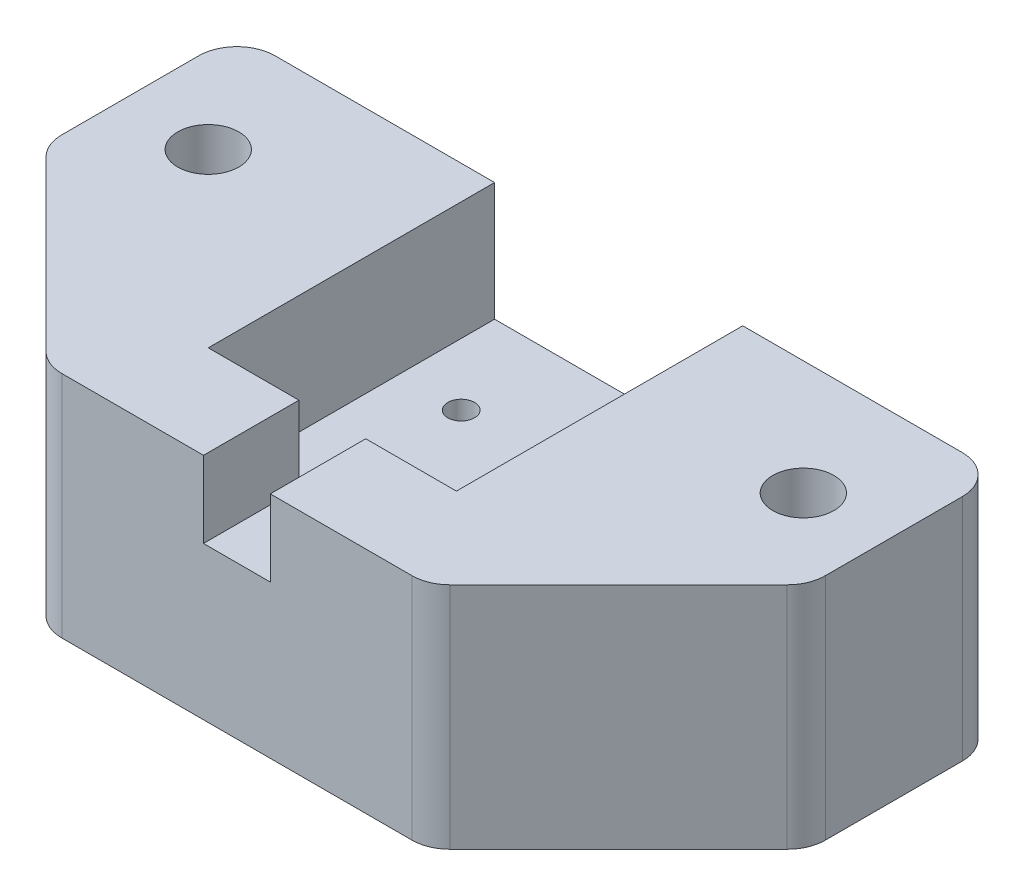
ISO-10303-21;
HEADER;
FILE_DESCRIPTION(('STEP AP214'),'2;1');
FILE_NAME('part.step','',(''),(''),'','','');
FILE_SCHEMA(('AUTOMOTIVE_DESIGN { 1 0 10303 214 1 1 1 1 }'));
ENDSEC;
DATA;
#1=APPLICATION_CONTEXT('core data for automotive mechanical design processes');
#2=APPLICATION_PROTOCOL_DEFINITION('international standard','automotive_design',2000,#1);
#3=PRODUCT_CONTEXT('',#1,'mechanical');
#4=PRODUCT('Part','Part','',(#3));
#5=PRODUCT_RELATED_PRODUCT_CATEGORY('part','',(#4));
#6=PRODUCT_DEFINITION_FORMATION('','',#4);
#7=PRODUCT_DEFINITION_CONTEXT('part definition',#1,'design');
#8=PRODUCT_DEFINITION('design','',#6,#7);
#9=PRODUCT_DEFINITION_SHAPE('','',#8);
#10=(LENGTH_UNIT() NAMED_UNIT(*) SI_UNIT(.MILLI.,.METRE.));
#11=(NAMED_UNIT(*) PLANE_ANGLE_UNIT() SI_UNIT($,.RADIAN.));
#12=(NAMED_UNIT(*) SI_UNIT($,.STERADIAN.) SOLID_ANGLE_UNIT());
#13=UNCERTAINTY_MEASURE_WITH_UNIT(LENGTH_MEASURE(1.E-05),#10,'distance_accuracy_value','');
#14=(GEOMETRIC_REPRESENTATION_CONTEXT(3) GLOBAL_UNCERTAINTY_ASSIGNED_CONTEXT((#13)) GLOBAL_UNIT_ASSIGNED_CONTEXT((#10,
#11,#12)) REPRESENTATION_CONTEXT('',''));
#15=CARTESIAN_POINT('',(0.,0.,0.));
#16=DIRECTION('',(0.,0.,1.));
#17=DIRECTION('',(1.,0.,0.));
#18=AXIS2_PLACEMENT_3D('',#15,#16,#17);
#19=CARTESIAN_POINT('',(4.5,12.,6.));
#20=DIRECTION('',(0.,-1.,0.));
#21=DIRECTION('',(0.,0.,-1.));
#22=AXIS2_PLACEMENT_3D('',#19,#20,#21);
#23=CYLINDRICAL_SURFACE('',#22,1.6);
#24=CARTESIAN_POINT('',(4.5,6.00000000000003,6.));
#25=DIRECTION('',(0.,-1.,0.));
#26=DIRECTION('',(0.,0.,-1.));
#27=AXIS2_PLACEMENT_3D('',#24,#25,#26);
#28=CIRCLE('',#27,1.6);
#29=CARTESIAN_POINT('',(4.5,6.00000000000003,4.4));
#30=VERTEX_POINT('',#29);
#31=EDGE_CURVE('E341',#30,#30,#28,.T.);
#32=ORIENTED_EDGE('',*,*,#31,.T.);
#33=EDGE_LOOP('',(#32));
#34=FACE_BOUND('',#33,.T.);
#35=CARTESIAN_POINT('',(4.5,12.,6.));
#36=DIRECTION('',(0.,1.,0.));
#37=DIRECTION('',(0.,0.,1.));
#38=AXIS2_PLACEMENT_3D('',#35,#36,#37);
#39=CIRCLE('',#38,1.6);
#40=CARTESIAN_POINT('',(4.5,12.,7.6));
#41=VERTEX_POINT('',#40);
#42=EDGE_CURVE('E250',#41,#41,#39,.T.);
#43=ORIENTED_EDGE('',*,*,#42,.T.);
#44=EDGE_LOOP('',(#43));
#45=FACE_BOUND('',#44,.T.);
#46=ADVANCED_FACE('F37',(#34,#45),#23,.F.);
#47=CARTESIAN_POINT('',(35.6728971962617,12.,6.));
#48=DIRECTION('',(0.,-1.,0.));
#49=DIRECTION('',(0.,0.,-1.));
#50=AXIS2_PLACEMENT_3D('',#47,#48,#49);
#51=CYLINDRICAL_SURFACE('',#50,1.6);
#52=CARTESIAN_POINT('',(35.6728971962617,6.00000000000003,6.));
#53=DIRECTION('',(0.,-1.,0.));
#54=DIRECTION('',(0.,0.,-1.));
#55=AXIS2_PLACEMENT_3D('',#52,#53,#54);
#56=CIRCLE('',#55,1.6);
#57=CARTESIAN_POINT('',(35.6728971962617,6.00000000000003,4.4));
#58=VERTEX_POINT('',#57);
#59=EDGE_CURVE('E338',#58,#58,#56,.T.);
#60=ORIENTED_EDGE('',*,*,#59,.T.);
#61=EDGE_LOOP('',(#60));
#62=FACE_BOUND('',#61,.T.);
#63=CARTESIAN_POINT('',(35.6728971962617,12.,6.));
#64=DIRECTION('',(0.,1.,0.));
#65=DIRECTION('',(0.,0.,1.));
#66=AXIS2_PLACEMENT_3D('',#63,#64,#65);
#67=CIRCLE('',#66,1.6);
#68=CARTESIAN_POINT('',(35.6728971962617,12.,7.6));
#69=VERTEX_POINT('',#68);
#70=EDGE_CURVE('E240',#69,#69,#67,.T.);
#71=ORIENTED_EDGE('',*,*,#70,.T.);
#72=EDGE_LOOP('',(#71));
#73=FACE_BOUND('',#72,.T.);
#74=ADVANCED_FACE('F355',(#62,#73),#51,.F.);
#75=CARTESIAN_POINT('',(0.,12.,0.));
#76=DIRECTION('',(0.,1.,0.));
#77=DIRECTION('',(0.,0.,1.));
#78=AXIS2_PLACEMENT_3D('',#75,#76,#77);
#79=PLANE('',#78);
#80=DIRECTION('',(-1.,0.,0.));
#81=VECTOR('',#80,1.);
#82=CARTESIAN_POINT('',(0.,12.,0.));
#83=LINE('',#82,#81);
#84=CARTESIAN_POINT('',(13.5,12.,0.));
#85=VERTEX_POINT('',#84);
#86=CARTESIAN_POINT('',(2.,12.,0.));
#87=VERTEX_POINT('',#86);
#88=EDGE_CURVE('E263',#85,#87,#83,.T.);
#89=ORIENTED_EDGE('',*,*,#88,.T.);
#90=CARTESIAN_POINT('',(2.,12.,2.));
#91=DIRECTION('',(0.,1.,0.));
#92=DIRECTION('',(0.,0.,1.));
#93=AXIS2_PLACEMENT_3D('',#90,#91,#92);
#94=CIRCLE('',#93,2.);
#95=CARTESIAN_POINT('',(0.,12.,2.));
#96=VERTEX_POINT('',#95);
#97=EDGE_CURVE('E313',#87,#96,#94,.T.);
#98=ORIENTED_EDGE('',*,*,#97,.T.);
#99=DIRECTION('',(0.,0.,1.));
#100=VECTOR('',#99,1.);
#101=CARTESIAN_POINT('',(0.,12.,0.));
#102=LINE('',#101,#100);
#103=CARTESIAN_POINT('',(0.,12.,9.17157287525378));
#104=VERTEX_POINT('',#103);
#105=EDGE_CURVE('E254',#96,#104,#102,.T.);
#106=ORIENTED_EDGE('',*,*,#105,.T.);
#107=CARTESIAN_POINT('',(2.,12.,9.17157287525378));
#108=DIRECTION('',(0.,1.,0.));
#109=DIRECTION('',(0.,0.,1.));
#110=AXIS2_PLACEMENT_3D('',#107,#108,#109);
#111=CIRCLE('',#110,2.);
#112=CARTESIAN_POINT('',(0.585786437626904,12.,10.5857864376269));
#113=VERTEX_POINT('',#112);
#114=EDGE_CURVE('E311',#104,#113,#111,.T.);
#115=ORIENTED_EDGE('',*,*,#114,.T.);
#116=DIRECTION('',(-0.707106781186546,0.,-0.707106781186549));
#117=VECTOR('',#116,1.);
#118=CARTESIAN_POINT('',(-4.99999999999999,12.,4.99999999999997));
#119=LINE('',#118,#117);
#120=CARTESIAN_POINT('',(9.4142135623731,12.,19.4142135623731));
#121=VERTEX_POINT('',#120);
#122=EDGE_CURVE('E283',#113,#121,#119,.F.);
#123=ORIENTED_EDGE('',*,*,#122,.T.);
#124=CARTESIAN_POINT('',(10.8284271247462,12.,18.));
#125=DIRECTION('',(0.,1.,0.));
#126=DIRECTION('',(0.,0.,1.));
#127=AXIS2_PLACEMENT_3D('',#124,#125,#126);
#128=CIRCLE('',#127,2.);
#129=CARTESIAN_POINT('',(10.8284271247462,12.,20.));
#130=VERTEX_POINT('',#129);
#131=EDGE_CURVE('E309',#121,#130,#128,.T.);
#132=ORIENTED_EDGE('',*,*,#131,.T.);
#133=DIRECTION('',(1.,0.,0.));
#134=VECTOR('',#133,1.);
#135=CARTESIAN_POINT('',(0.,12.,20.));
#136=LINE('',#135,#134);
#137=CARTESIAN_POINT('',(18.25,12.,20.));
#138=VERTEX_POINT('',#137);
#139=EDGE_CURVE('E259',#130,#138,#136,.T.);
#140=ORIENTED_EDGE('',*,*,#139,.T.);
#141=DIRECTION('',(0.,0.,1.));
#142=VECTOR('',#141,1.);
#143=CARTESIAN_POINT('',(18.25,12.,15.));
#144=LINE('',#143,#142);
#145=CARTESIAN_POINT('',(18.25,12.,15.));
#146=VERTEX_POINT('',#145);
#147=EDGE_CURVE('E183',#146,#138,#144,.T.);
#148=ORIENTED_EDGE('',*,*,#147,.F.);
#149=DIRECTION('',(1.,0.,0.));
#150=VECTOR('',#149,1.);
#151=CARTESIAN_POINT('',(13.5,12.,15.));
#152=LINE('',#151,#150);
#153=CARTESIAN_POINT('',(13.5,12.,15.));
#154=VERTEX_POINT('',#153);
#155=EDGE_CURVE('E233',#154,#146,#152,.T.);
#156=ORIENTED_EDGE('',*,*,#155,.F.);
#157=DIRECTION('',(0.,0.,1.));
#158=VECTOR('',#157,1.);
#159=CARTESIAN_POINT('',(13.5,12.,0.));
#160=LINE('',#159,#158);
#161=EDGE_CURVE('E212',#85,#154,#160,.T.);
#162=ORIENTED_EDGE('',*,*,#161,.F.);
#163=EDGE_LOOP('',(#89,#98,#106,#115,#123,#132,#140,#148,#156,#162));
#164=FACE_BOUND('',#163,.T.);
#165=ORIENTED_EDGE('',*,*,#42,.F.);
#166=EDGE_LOOP('',(#165));
#167=FACE_BOUND('',#166,.T.);
#168=ADVANCED_FACE('F358',(#164,#167),#79,.T.);
#169=CARTESIAN_POINT('',(21.75,12.,20.));
#170=VERTEX_POINT('',#169);
#171=CARTESIAN_POINT('',(29.1715728752538,12.,20.));
#172=VERTEX_POINT('',#171);
#173=EDGE_CURVE('E257',#170,#172,#136,.T.);
#174=ORIENTED_EDGE('',*,*,#173,.T.);
#175=CARTESIAN_POINT('',(29.1715728752538,12.,18.));
#176=DIRECTION('',(0.,1.,0.));
#177=DIRECTION('',(0.,0.,1.));
#178=AXIS2_PLACEMENT_3D('',#175,#176,#177);
#179=CIRCLE('',#178,2.);
#180=CARTESIAN_POINT('',(30.5857864376269,12.,19.4142135623731));
#181=VERTEX_POINT('',#180);
#182=EDGE_CURVE('E328',#172,#181,#179,.T.);
#183=ORIENTED_EDGE('',*,*,#182,.T.);
#184=DIRECTION('',(-0.707106781186549,0.,0.707106781186546));
#185=VECTOR('',#184,1.);
#186=CARTESIAN_POINT('',(24.9999999999999,12.,25.));
#187=LINE('',#186,#185);
#188=CARTESIAN_POINT('',(39.4142135623731,12.,10.5857864376269));
#189=VERTEX_POINT('',#188);
#190=EDGE_CURVE('E281',#181,#189,#187,.F.);
#191=ORIENTED_EDGE('',*,*,#190,.T.);
#192=CARTESIAN_POINT('',(38.,12.,9.17157287525381));
#193=DIRECTION('',(0.,1.,0.));
#194=DIRECTION('',(0.,0.,1.));
#195=AXIS2_PLACEMENT_3D('',#192,#193,#194);
#196=CIRCLE('',#195,2.);
#197=CARTESIAN_POINT('',(40.,12.,9.17157287525381));
#198=VERTEX_POINT('',#197);
#199=EDGE_CURVE('E60',#189,#198,#196,.T.);
#200=ORIENTED_EDGE('',*,*,#199,.T.);
#201=DIRECTION('',(0.,0.,-1.));
#202=VECTOR('',#201,1.);
#203=CARTESIAN_POINT('',(40.,12.,0.));
#204=LINE('',#203,#202);
#205=CARTESIAN_POINT('',(40.,12.,2.));
#206=VERTEX_POINT('',#205);
#207=EDGE_CURVE('E261',#198,#206,#204,.T.);
#208=ORIENTED_EDGE('',*,*,#207,.T.);
#209=CARTESIAN_POINT('',(38.,12.,2.));
#210=DIRECTION('',(0.,1.,0.));
#211=DIRECTION('',(0.,0.,1.));
#212=AXIS2_PLACEMENT_3D('',#209,#210,#211);
#213=CIRCLE('',#212,2.);
#214=CARTESIAN_POINT('',(38.,12.,0.));
#215=VERTEX_POINT('',#214);
#216=EDGE_CURVE('E325',#206,#215,#213,.T.);
#217=ORIENTED_EDGE('',*,*,#216,.T.);
#218=CARTESIAN_POINT('',(26.5,12.,0.));
#219=VERTEX_POINT('',#218);
#220=EDGE_CURVE('E264',#215,#219,#83,.T.);
#221=ORIENTED_EDGE('',*,*,#220,.T.);
#222=DIRECTION('',(0.,0.,-1.));
#223=VECTOR('',#222,1.);
#224=CARTESIAN_POINT('',(26.5,12.,0.));
#225=LINE('',#224,#223);
#226=CARTESIAN_POINT('',(26.5,12.,15.));
#227=VERTEX_POINT('',#226);
#228=EDGE_CURVE('E221',#227,#219,#225,.T.);
#229=ORIENTED_EDGE('',*,*,#228,.F.);
#230=CARTESIAN_POINT('',(21.75,12.,15.));
#231=VERTEX_POINT('',#230);
#232=EDGE_CURVE('E232',#231,#227,#152,.T.);
#233=ORIENTED_EDGE('',*,*,#232,.F.);
#234=DIRECTION('',(0.,0.,-1.));
#235=VECTOR('',#234,1.);
#236=CARTESIAN_POINT('',(21.75,12.,15.));
#237=LINE('',#236,#235);
#238=EDGE_CURVE('E197',#170,#231,#237,.T.);
#239=ORIENTED_EDGE('',*,*,#238,.F.);
#240=EDGE_LOOP('',(#174,#183,#191,#200,#208,#217,#221,#229,#233,#239));
#241=FACE_BOUND('',#240,.T.);
#242=ORIENTED_EDGE('',*,*,#70,.F.);
#243=EDGE_LOOP('',(#242));
#244=FACE_BOUND('',#243,.T.);
#245=ADVANCED_FACE('F362',(#241,#244),#79,.T.);
#246=CARTESIAN_POINT('',(0.,0.,0.));
#247=DIRECTION('',(0.,1.,0.));
#248=DIRECTION('',(0.,0.,1.));
#249=AXIS2_PLACEMENT_3D('',#246,#247,#248);
#250=PLANE('',#249);
#251=CARTESIAN_POINT('',(35.6728971962617,0.,6.));
#252=DIRECTION('',(0.,-1.,0.));
#253=DIRECTION('',(0.,0.,-1.));
#254=AXIS2_PLACEMENT_3D('',#251,#252,#253);
#255=CIRCLE('',#254,3.);
#256=CARTESIAN_POINT('',(35.6728971962617,0.,3.));
#257=VERTEX_POINT('',#256);
#258=EDGE_CURVE('E702',#257,#257,#255,.T.);
#259=ORIENTED_EDGE('',*,*,#258,.F.);
#260=EDGE_LOOP('',(#259));
#261=FACE_BOUND('',#260,.T.);
#262=CARTESIAN_POINT('',(4.5,0.,6.));
#263=DIRECTION('',(0.,-1.,0.));
#264=DIRECTION('',(0.,0.,-1.));
#265=AXIS2_PLACEMENT_3D('',#262,#263,#264);
#266=CIRCLE('',#265,3.);
#267=CARTESIAN_POINT('',(4.5,0.,3.));
#268=VERTEX_POINT('',#267);
#269=EDGE_CURVE('E700',#268,#268,#266,.T.);
#270=ORIENTED_EDGE('',*,*,#269,.F.);
#271=EDGE_LOOP('',(#270));
#272=FACE_BOUND('',#271,.T.);
#273=CARTESIAN_POINT('',(16.75,0.,5.));
#274=DIRECTION('',(0.,1.,0.));
#275=DIRECTION('',(0.,0.,1.));
#276=AXIS2_PLACEMENT_3D('',#273,#274,#275);
#277=CIRCLE('',#276,0.699999999999998);
#278=CARTESIAN_POINT('',(16.75,0.,5.7));
#279=VERTEX_POINT('',#278);
#280=EDGE_CURVE('E208',#279,#279,#277,.T.);
#281=ORIENTED_EDGE('',*,*,#280,.T.);
#282=EDGE_LOOP('',(#281));
#283=FACE_BOUND('',#282,.T.);
#284=CARTESIAN_POINT('',(23.25,0.,5.));
#285=DIRECTION('',(0.,1.,0.));
#286=DIRECTION('',(0.,0.,1.));
#287=AXIS2_PLACEMENT_3D('',#284,#285,#286);
#288=CIRCLE('',#287,0.699999999999998);
#289=CARTESIAN_POINT('',(23.25,0.,5.7));
#290=VERTEX_POINT('',#289);
#291=EDGE_CURVE('E713',#290,#290,#288,.T.);
#292=ORIENTED_EDGE('',*,*,#291,.T.);
#293=EDGE_LOOP('',(#292));
#294=FACE_BOUND('',#293,.T.);
#295=DIRECTION('',(0.,0.,1.));
#296=VECTOR('',#295,1.);
#297=CARTESIAN_POINT('',(0.,0.,0.));
#298=LINE('',#297,#296);
#299=CARTESIAN_POINT('',(0.,0.,2.));
#300=VERTEX_POINT('',#299);
#301=CARTESIAN_POINT('',(0.,0.,9.17157287525378));
#302=VERTEX_POINT('',#301);
#303=EDGE_CURVE('E253',#300,#302,#298,.T.);
#304=ORIENTED_EDGE('',*,*,#303,.F.);
#305=CARTESIAN_POINT('',(2.,0.,2.));
#306=DIRECTION('',(0.,1.,0.));
#307=DIRECTION('',(0.,0.,1.));
#308=AXIS2_PLACEMENT_3D('',#305,#306,#307);
#309=CIRCLE('',#308,2.);
#310=CARTESIAN_POINT('',(2.,0.,0.));
#311=VERTEX_POINT('',#310);
#312=EDGE_CURVE('E302',#300,#311,#309,.F.);
#313=ORIENTED_EDGE('',*,*,#312,.T.);
#314=DIRECTION('',(-1.,0.,0.));
#315=VECTOR('',#314,1.);
#316=CARTESIAN_POINT('',(0.,0.,0.));
#317=LINE('',#316,#315);
#318=CARTESIAN_POINT('',(38.,0.,0.));
#319=VERTEX_POINT('',#318);
#320=EDGE_CURVE('E258',#319,#311,#317,.T.);
#321=ORIENTED_EDGE('',*,*,#320,.F.);
#322=CARTESIAN_POINT('',(38.,0.,2.));
#323=DIRECTION('',(0.,1.,0.));
#324=DIRECTION('',(0.,0.,1.));
#325=AXIS2_PLACEMENT_3D('',#322,#323,#324);
#326=CIRCLE('',#325,2.);
#327=CARTESIAN_POINT('',(40.,0.,2.));
#328=VERTEX_POINT('',#327);
#329=EDGE_CURVE('E292',#319,#328,#326,.F.);
#330=ORIENTED_EDGE('',*,*,#329,.T.);
#331=DIRECTION('',(0.,0.,-1.));
#332=VECTOR('',#331,1.);
#333=CARTESIAN_POINT('',(40.,0.,0.));
#334=LINE('',#333,#332);
#335=CARTESIAN_POINT('',(40.,0.,9.17157287525381));
#336=VERTEX_POINT('',#335);
#337=EDGE_CURVE('E272',#336,#328,#334,.T.);
#338=ORIENTED_EDGE('',*,*,#337,.F.);
#339=CARTESIAN_POINT('',(38.,0.,9.17157287525381));
#340=DIRECTION('',(0.,1.,0.));
#341=DIRECTION('',(0.,0.,1.));
#342=AXIS2_PLACEMENT_3D('',#339,#340,#341);
#343=CIRCLE('',#342,2.);
#344=CARTESIAN_POINT('',(39.4142135623731,0.,10.5857864376269));
#345=VERTEX_POINT('',#344);
#346=EDGE_CURVE('E294',#336,#345,#343,.F.);
#347=ORIENTED_EDGE('',*,*,#346,.T.);
#348=DIRECTION('',(0.707106781186549,0.,-0.707106781186546));
#349=VECTOR('',#348,1.);
#350=CARTESIAN_POINT('',(40.,0.,10.));
#351=LINE('',#350,#349);
#352=CARTESIAN_POINT('',(30.5857864376269,0.,19.4142135623731));
#353=VERTEX_POINT('',#352);
#354=EDGE_CURVE('E278',#345,#353,#351,.F.);
#355=ORIENTED_EDGE('',*,*,#354,.T.);
#356=CARTESIAN_POINT('',(29.1715728752538,0.,18.));
#357=DIRECTION('',(0.,1.,0.));
#358=DIRECTION('',(0.,0.,1.));
#359=AXIS2_PLACEMENT_3D('',#356,#357,#358);
#360=CIRCLE('',#359,2.);
#361=CARTESIAN_POINT('',(29.1715728752538,0.,20.));
#362=VERTEX_POINT('',#361);
#363=EDGE_CURVE('E296',#353,#362,#360,.F.);
#364=ORIENTED_EDGE('',*,*,#363,.T.);
#365=DIRECTION('',(1.,0.,0.));
#366=VECTOR('',#365,1.);
#367=CARTESIAN_POINT('',(0.,0.,20.));
#368=LINE('',#367,#366);
#369=CARTESIAN_POINT('',(10.8284271247462,0.,20.));
#370=VERTEX_POINT('',#369);
#371=EDGE_CURVE('E269',#370,#362,#368,.T.);
#372=ORIENTED_EDGE('',*,*,#371,.F.);
#373=CARTESIAN_POINT('',(10.8284271247462,0.,18.));
#374=DIRECTION('',(0.,1.,0.));
#375=DIRECTION('',(0.,0.,1.));
#376=AXIS2_PLACEMENT_3D('',#373,#374,#375);
#377=CIRCLE('',#376,2.);
#378=CARTESIAN_POINT('',(9.41421356237309,0.,19.4142135623731));
#379=VERTEX_POINT('',#378);
#380=EDGE_CURVE('E298',#370,#379,#377,.F.);
#381=ORIENTED_EDGE('',*,*,#380,.T.);
#382=DIRECTION('',(0.707106781186546,0.,0.707106781186549));
#383=VECTOR('',#382,1.);
#384=CARTESIAN_POINT('',(10.,0.,20.));
#385=LINE('',#384,#383);
#386=CARTESIAN_POINT('',(0.585786437626903,0.,10.5857864376269));
#387=VERTEX_POINT('',#386);
#388=EDGE_CURVE('E266',#379,#387,#385,.F.);
#389=ORIENTED_EDGE('',*,*,#388,.T.);
#390=CARTESIAN_POINT('',(2.,0.,9.17157287525378));
#391=DIRECTION('',(0.,1.,0.));
#392=DIRECTION('',(0.,0.,1.));
#393=AXIS2_PLACEMENT_3D('',#390,#391,#392);
#394=CIRCLE('',#393,2.);
#395=EDGE_CURVE('E300',#387,#302,#394,.F.);
#396=ORIENTED_EDGE('',*,*,#395,.T.);
#397=EDGE_LOOP('',(#304,#313,#321,#330,#338,#347,#355,#364,#372,#381,#389,#396));
#398=FACE_BOUND('',#397,.T.);
#399=ADVANCED_FACE('F364',(#261,#272,#283,#294,#398),#250,.F.);
#400=CARTESIAN_POINT('',(0.,12.,0.));
#401=DIRECTION('',(1.,0.,0.));
#402=DIRECTION('',(0.,0.,-1.));
#403=AXIS2_PLACEMENT_3D('',#400,#401,#402);
#404=PLANE('',#403);
#405=ORIENTED_EDGE('',*,*,#105,.F.);
#406=DIRECTION('',(0.,-1.,0.));
#407=VECTOR('',#406,1.);
#408=CARTESIAN_POINT('',(0.,12.,2.));
#409=LINE('',#408,#407);
#410=EDGE_CURVE('E289',#96,#300,#409,.T.);
#411=ORIENTED_EDGE('',*,*,#410,.T.);
#412=ORIENTED_EDGE('',*,*,#303,.T.);
#413=DIRECTION('',(0.,-1.,0.));
#414=VECTOR('',#413,1.);
#415=CARTESIAN_POINT('',(0.,12.,9.17157287525378));
#416=LINE('',#415,#414);
#417=EDGE_CURVE('E286',#302,#104,#416,.F.);
#418=ORIENTED_EDGE('',*,*,#417,.T.);
#419=EDGE_LOOP('',(#405,#411,#412,#418));
#420=FACE_BOUND('',#419,.T.);
#421=ADVANCED_FACE('F370',(#420),#404,.F.);
#422=CARTESIAN_POINT('',(0.,12.,20.));
#423=DIRECTION('',(0.,0.,-1.));
#424=DIRECTION('',(-1.,0.,0.));
#425=AXIS2_PLACEMENT_3D('',#422,#423,#424);
#426=PLANE('',#425);
#427=ORIENTED_EDGE('',*,*,#139,.F.);
#428=DIRECTION('',(0.,1.,0.));
#429=VECTOR('',#428,1.);
#430=CARTESIAN_POINT('',(10.8284271247462,0.,20.));
#431=LINE('',#430,#429);
#432=EDGE_CURVE('E322',#130,#370,#431,.F.);
#433=ORIENTED_EDGE('',*,*,#432,.T.);
#434=ORIENTED_EDGE('',*,*,#371,.T.);
#435=DIRECTION('',(0.,-1.,0.));
#436=VECTOR('',#435,1.);
#437=CARTESIAN_POINT('',(29.1715728752538,12.,20.));
#438=LINE('',#437,#436);
#439=EDGE_CURVE('E319',#362,#172,#438,.F.);
#440=ORIENTED_EDGE('',*,*,#439,.T.);
#441=ORIENTED_EDGE('',*,*,#173,.F.);
#442=DIRECTION('',(0.,1.,0.));
#443=VECTOR('',#442,1.);
#444=CARTESIAN_POINT('',(21.75,8.,20.));
#445=LINE('',#444,#443);
#446=CARTESIAN_POINT('',(21.75,8.,20.));
#447=VERTEX_POINT('',#446);
#448=EDGE_CURVE('E187',#447,#170,#445,.T.);
#449=ORIENTED_EDGE('',*,*,#448,.F.);
#450=DIRECTION('',(1.,0.,0.));
#451=VECTOR('',#450,1.);
#452=CARTESIAN_POINT('',(18.25,8.,20.));
#453=LINE('',#452,#451);
#454=CARTESIAN_POINT('',(18.25,8.,20.));
#455=VERTEX_POINT('',#454);
#456=EDGE_CURVE('E193',#455,#447,#453,.T.);
#457=ORIENTED_EDGE('',*,*,#456,.F.);
#458=DIRECTION('',(0.,1.,0.));
#459=VECTOR('',#458,1.);
#460=CARTESIAN_POINT('',(18.25,8.,20.));
#461=LINE('',#460,#459);
#462=EDGE_CURVE('E177',#455,#138,#461,.T.);
#463=ORIENTED_EDGE('',*,*,#462,.T.);
#464=EDGE_LOOP('',(#427,#433,#434,#440,#441,#449,#457,#463));
#465=FACE_BOUND('',#464,.T.);
#466=ADVANCED_FACE('F199',(#465),#426,.F.);
#467=CARTESIAN_POINT('',(40.,12.,0.));
#468=DIRECTION('',(-1.,0.,0.));
#469=DIRECTION('',(0.,0.,1.));
#470=AXIS2_PLACEMENT_3D('',#467,#468,#469);
#471=PLANE('',#470);
#472=ORIENTED_EDGE('',*,*,#207,.F.);
#473=DIRECTION('',(0.,1.,0.));
#474=VECTOR('',#473,1.);
#475=CARTESIAN_POINT('',(40.,0.,9.17157287525381));
#476=LINE('',#475,#474);
#477=EDGE_CURVE('E335',#198,#336,#476,.F.);
#478=ORIENTED_EDGE('',*,*,#477,.T.);
#479=ORIENTED_EDGE('',*,*,#337,.T.);
#480=DIRECTION('',(0.,-1.,0.));
#481=VECTOR('',#480,1.);
#482=CARTESIAN_POINT('',(40.,12.,2.));
#483=LINE('',#482,#481);
#484=EDGE_CURVE('E53',#328,#206,#483,.F.);
#485=ORIENTED_EDGE('',*,*,#484,.T.);
#486=EDGE_LOOP('',(#472,#478,#479,#485));
#487=FACE_BOUND('',#486,.T.);
#488=ADVANCED_FACE('F584',(#487),#471,.F.);
#489=CARTESIAN_POINT('',(0.,12.,0.));
#490=DIRECTION('',(0.,0.,1.));
#491=DIRECTION('',(1.,0.,0.));
#492=AXIS2_PLACEMENT_3D('',#489,#490,#491);
#493=PLANE('',#492);
#494=ORIENTED_EDGE('',*,*,#320,.T.);
#495=DIRECTION('',(0.,-1.,0.));
#496=VECTOR('',#495,1.);
#497=CARTESIAN_POINT('',(2.,12.,0.));
#498=LINE('',#497,#496);
#499=EDGE_CURVE('E307',#311,#87,#498,.F.);
#500=ORIENTED_EDGE('',*,*,#499,.T.);
#501=ORIENTED_EDGE('',*,*,#88,.F.);
#502=DIRECTION('',(0.,1.,0.));
#503=VECTOR('',#502,1.);
#504=CARTESIAN_POINT('',(13.5,5.8,0.));
#505=LINE('',#504,#503);
#506=CARTESIAN_POINT('',(13.5,5.8,0.));
#507=VERTEX_POINT('',#506);
#508=EDGE_CURVE('E238',#507,#85,#505,.T.);
#509=ORIENTED_EDGE('',*,*,#508,.F.);
#510=DIRECTION('',(-1.,0.,0.));
#511=VECTOR('',#510,1.);
#512=CARTESIAN_POINT('',(13.5,5.8,0.));
#513=LINE('',#512,#511);
#514=CARTESIAN_POINT('',(26.5,5.8,0.));
#515=VERTEX_POINT('',#514);
#516=EDGE_CURVE('E226',#515,#507,#513,.T.);
#517=ORIENTED_EDGE('',*,*,#516,.F.);
#518=DIRECTION('',(0.,1.,0.));
#519=VECTOR('',#518,1.);
#520=CARTESIAN_POINT('',(26.5,5.8,0.));
#521=LINE('',#520,#519);
#522=EDGE_CURVE('E241',#515,#219,#521,.T.);
#523=ORIENTED_EDGE('',*,*,#522,.T.);
#524=ORIENTED_EDGE('',*,*,#220,.F.);
#525=DIRECTION('',(0.,-1.,0.));
#526=VECTOR('',#525,1.);
#527=CARTESIAN_POINT('',(38.,12.,0.));
#528=LINE('',#527,#526);
#529=EDGE_CURVE('E304',#215,#319,#528,.T.);
#530=ORIENTED_EDGE('',*,*,#529,.T.);
#531=EDGE_LOOP('',(#494,#500,#501,#509,#517,#523,#524,#530));
#532=FACE_BOUND('',#531,.T.);
#533=ADVANCED_FACE('F386',(#532),#493,.F.);
#534=CARTESIAN_POINT('',(13.5,5.8,0.));
#535=DIRECTION('',(-1.,0.,0.));
#536=DIRECTION('',(0.,0.,1.));
#537=AXIS2_PLACEMENT_3D('',#534,#535,#536);
#538=PLANE('',#537);
#539=ORIENTED_EDGE('',*,*,#161,.T.);
#540=DIRECTION('',(0.,1.,0.));
#541=VECTOR('',#540,1.);
#542=CARTESIAN_POINT('',(13.5,5.8,15.));
#543=LINE('',#542,#541);
#544=CARTESIAN_POINT('',(13.5,5.8,15.));
#545=VERTEX_POINT('',#544);
#546=EDGE_CURVE('E229',#545,#154,#543,.T.);
#547=ORIENTED_EDGE('',*,*,#546,.F.);
#548=DIRECTION('',(0.,0.,1.));
#549=VECTOR('',#548,1.);
#550=CARTESIAN_POINT('',(13.5,5.8,0.));
#551=LINE('',#550,#549);
#552=EDGE_CURVE('E217',#507,#545,#551,.T.);
#553=ORIENTED_EDGE('',*,*,#552,.F.);
#554=ORIENTED_EDGE('',*,*,#508,.T.);
#555=EDGE_LOOP('',(#539,#547,#553,#554));
#556=FACE_BOUND('',#555,.T.);
#557=ADVANCED_FACE('F382',(#556),#538,.F.);
#558=CARTESIAN_POINT('',(26.5,5.8,0.));
#559=DIRECTION('',(1.,0.,0.));
#560=DIRECTION('',(0.,0.,-1.));
#561=AXIS2_PLACEMENT_3D('',#558,#559,#560);
#562=PLANE('',#561);
#563=ORIENTED_EDGE('',*,*,#228,.T.);
#564=ORIENTED_EDGE('',*,*,#522,.F.);
#565=DIRECTION('',(0.,0.,-1.));
#566=VECTOR('',#565,1.);
#567=CARTESIAN_POINT('',(26.5,5.8,0.));
#568=LINE('',#567,#566);
#569=CARTESIAN_POINT('',(26.5,5.8,15.));
#570=VERTEX_POINT('',#569);
#571=EDGE_CURVE('E224',#570,#515,#568,.T.);
#572=ORIENTED_EDGE('',*,*,#571,.F.);
#573=DIRECTION('',(0.,1.,0.));
#574=VECTOR('',#573,1.);
#575=CARTESIAN_POINT('',(26.5,5.8,15.));
#576=LINE('',#575,#574);
#577=EDGE_CURVE('E244',#570,#227,#576,.T.);
#578=ORIENTED_EDGE('',*,*,#577,.T.);
#579=EDGE_LOOP('',(#563,#564,#572,#578));
#580=FACE_BOUND('',#579,.T.);
#581=ADVANCED_FACE('F385',(#580),#562,.F.);
#582=CARTESIAN_POINT('',(13.5,5.8,15.));
#583=DIRECTION('',(0.,0.,1.));
#584=DIRECTION('',(1.,0.,0.));
#585=AXIS2_PLACEMENT_3D('',#582,#583,#584);
#586=PLANE('',#585);
#587=ORIENTED_EDGE('',*,*,#155,.T.);
#588=DIRECTION('',(0.,1.,0.));
#589=VECTOR('',#588,1.);
#590=CARTESIAN_POINT('',(18.25,8.,15.));
#591=LINE('',#590,#589);
#592=CARTESIAN_POINT('',(18.25,8.,15.));
#593=VERTEX_POINT('',#592);
#594=EDGE_CURVE('E210',#593,#146,#591,.T.);
#595=ORIENTED_EDGE('',*,*,#594,.F.);
#596=DIRECTION('',(-1.,0.,0.));
#597=VECTOR('',#596,1.);
#598=CARTESIAN_POINT('',(18.25,8.,15.));
#599=LINE('',#598,#597);
#600=CARTESIAN_POINT('',(21.75,8.,15.));
#601=VERTEX_POINT('',#600);
#602=EDGE_CURVE('E188',#601,#593,#599,.T.);
#603=ORIENTED_EDGE('',*,*,#602,.F.);
#604=DIRECTION('',(0.,1.,0.));
#605=VECTOR('',#604,1.);
#606=CARTESIAN_POINT('',(21.75,8.,15.));
#607=LINE('',#606,#605);
#608=EDGE_CURVE('E213',#601,#231,#607,.T.);
#609=ORIENTED_EDGE('',*,*,#608,.T.);
#610=ORIENTED_EDGE('',*,*,#232,.T.);
#611=ORIENTED_EDGE('',*,*,#577,.F.);
#612=DIRECTION('',(1.,0.,0.));
#613=VECTOR('',#612,1.);
#614=CARTESIAN_POINT('',(13.5,5.8,15.));
#615=LINE('',#614,#613);
#616=EDGE_CURVE('E220',#545,#570,#615,.T.);
#617=ORIENTED_EDGE('',*,*,#616,.F.);
#618=ORIENTED_EDGE('',*,*,#546,.T.);
#619=EDGE_LOOP('',(#587,#595,#603,#609,#610,#611,#617,#618));
#620=FACE_BOUND('',#619,.T.);
#621=ADVANCED_FACE('F388',(#620),#586,.F.);
#622=CARTESIAN_POINT('',(0.,5.8,0.));
#623=DIRECTION('',(0.,1.,0.));
#624=DIRECTION('',(0.,0.,1.));
#625=AXIS2_PLACEMENT_3D('',#622,#623,#624);
#626=PLANE('',#625);
#627=CARTESIAN_POINT('',(16.75,5.8,5.));
#628=DIRECTION('',(0.,1.,0.));
#629=DIRECTION('',(0.,0.,1.));
#630=AXIS2_PLACEMENT_3D('',#627,#628,#629);
#631=CIRCLE('',#630,0.699999999999998);
#632=CARTESIAN_POINT('',(16.75,5.8,5.7));
#633=VERTEX_POINT('',#632);
#634=EDGE_CURVE('E710',#633,#633,#631,.T.);
#635=ORIENTED_EDGE('',*,*,#634,.F.);
#636=EDGE_LOOP('',(#635));
#637=FACE_BOUND('',#636,.T.);
#638=CARTESIAN_POINT('',(23.25,5.8,5.));
#639=DIRECTION('',(0.,1.,0.));
#640=DIRECTION('',(0.,0.,1.));
#641=AXIS2_PLACEMENT_3D('',#638,#639,#640);
#642=CIRCLE('',#641,0.699999999999998);
#643=CARTESIAN_POINT('',(23.25,5.8,5.7));
#644=VERTEX_POINT('',#643);
#645=EDGE_CURVE('E705',#644,#644,#642,.T.);
#646=ORIENTED_EDGE('',*,*,#645,.F.);
#647=EDGE_LOOP('',(#646));
#648=FACE_BOUND('',#647,.T.);
#649=ORIENTED_EDGE('',*,*,#552,.T.);
#650=ORIENTED_EDGE('',*,*,#616,.T.);
#651=ORIENTED_EDGE('',*,*,#571,.T.);
#652=ORIENTED_EDGE('',*,*,#516,.T.);
#653=EDGE_LOOP('',(#649,#650,#651,#652));
#654=FACE_BOUND('',#653,.T.);
#655=ADVANCED_FACE('F391',(#637,#648,#654),#626,.T.);
#656=CARTESIAN_POINT('',(18.25,8.,15.));
#657=DIRECTION('',(-1.,0.,0.));
#658=DIRECTION('',(0.,0.,1.));
#659=AXIS2_PLACEMENT_3D('',#656,#657,#658);
#660=PLANE('',#659);
#661=ORIENTED_EDGE('',*,*,#147,.T.);
#662=ORIENTED_EDGE('',*,*,#462,.F.);
#663=DIRECTION('',(0.,0.,1.));
#664=VECTOR('',#663,1.);
#665=CARTESIAN_POINT('',(18.25,8.,15.));
#666=LINE('',#665,#664);
#667=EDGE_CURVE('E180',#593,#455,#666,.T.);
#668=ORIENTED_EDGE('',*,*,#667,.F.);
#669=ORIENTED_EDGE('',*,*,#594,.T.);
#670=EDGE_LOOP('',(#661,#662,#668,#669));
#671=FACE_BOUND('',#670,.T.);
#672=ADVANCED_FACE('F179',(#671),#660,.F.);
#673=CARTESIAN_POINT('',(21.75,8.,15.));
#674=DIRECTION('',(1.,0.,0.));
#675=DIRECTION('',(0.,0.,-1.));
#676=AXIS2_PLACEMENT_3D('',#673,#674,#675);
#677=PLANE('',#676);
#678=ORIENTED_EDGE('',*,*,#238,.T.);
#679=ORIENTED_EDGE('',*,*,#608,.F.);
#680=DIRECTION('',(0.,0.,-1.));
#681=VECTOR('',#680,1.);
#682=CARTESIAN_POINT('',(21.75,8.,15.));
#683=LINE('',#682,#681);
#684=EDGE_CURVE('E201',#447,#601,#683,.T.);
#685=ORIENTED_EDGE('',*,*,#684,.F.);
#686=ORIENTED_EDGE('',*,*,#448,.T.);
#687=EDGE_LOOP('',(#678,#679,#685,#686));
#688=FACE_BOUND('',#687,.T.);
#689=ADVANCED_FACE('F401',(#688),#677,.F.);
#690=CARTESIAN_POINT('',(0.,8.,0.));
#691=DIRECTION('',(0.,1.,0.));
#692=DIRECTION('',(0.,0.,1.));
#693=AXIS2_PLACEMENT_3D('',#690,#691,#692);
#694=PLANE('',#693);
#695=ORIENTED_EDGE('',*,*,#667,.T.);
#696=ORIENTED_EDGE('',*,*,#456,.T.);
#697=ORIENTED_EDGE('',*,*,#684,.T.);
#698=ORIENTED_EDGE('',*,*,#602,.T.);
#699=EDGE_LOOP('',(#695,#696,#697,#698));
#700=FACE_BOUND('',#699,.T.);
#701=ADVANCED_FACE('F192',(#700),#694,.T.);
#702=CARTESIAN_POINT('',(40.,12.,10.));
#703=DIRECTION('',(-0.707106781186546,0.,-0.707106781186549));
#704=DIRECTION('',(0.,-1.,0.));
#705=AXIS2_PLACEMENT_3D('',#702,#703,#704);
#706=PLANE('',#705);
#707=ORIENTED_EDGE('',*,*,#190,.F.);
#708=DIRECTION('',(0.,1.,0.));
#709=VECTOR('',#708,1.);
#710=CARTESIAN_POINT('',(30.5857864376269,0.,19.4142135623731));
#711=LINE('',#710,#709);
#712=EDGE_CURVE('E332',#181,#353,#711,.F.);
#713=ORIENTED_EDGE('',*,*,#712,.T.);
#714=ORIENTED_EDGE('',*,*,#354,.F.);
#715=DIRECTION('',(0.,-1.,0.));
#716=VECTOR('',#715,1.);
#717=CARTESIAN_POINT('',(39.4142135623731,12.,10.5857864376269));
#718=LINE('',#717,#716);
#719=EDGE_CURVE('E330',#345,#189,#718,.F.);
#720=ORIENTED_EDGE('',*,*,#719,.T.);
#721=EDGE_LOOP('',(#707,#713,#714,#720));
#722=FACE_BOUND('',#721,.T.);
#723=ADVANCED_FACE('F407',(#722),#706,.F.);
#724=CARTESIAN_POINT('',(10.,12.,20.));
#725=DIRECTION('',(0.707106781186549,0.,-0.707106781186546));
#726=DIRECTION('',(0.,-1.,0.));
#727=AXIS2_PLACEMENT_3D('',#724,#725,#726);
#728=PLANE('',#727);
#729=ORIENTED_EDGE('',*,*,#122,.F.);
#730=DIRECTION('',(0.,1.,0.));
#731=VECTOR('',#730,1.);
#732=CARTESIAN_POINT('',(0.585786437626904,0.,10.5857864376269));
#733=LINE('',#732,#731);
#734=EDGE_CURVE('E317',#113,#387,#733,.F.);
#735=ORIENTED_EDGE('',*,*,#734,.T.);
#736=ORIENTED_EDGE('',*,*,#388,.F.);
#737=DIRECTION('',(0.,-1.,0.));
#738=VECTOR('',#737,1.);
#739=CARTESIAN_POINT('',(9.41421356237309,12.,19.4142135623731));
#740=LINE('',#739,#738);
#741=EDGE_CURVE('E315',#379,#121,#740,.F.);
#742=ORIENTED_EDGE('',*,*,#741,.T.);
#743=EDGE_LOOP('',(#729,#735,#736,#742));
#744=FACE_BOUND('',#743,.T.);
#745=ADVANCED_FACE('F520',(#744),#728,.F.);
#746=CARTESIAN_POINT('',(2.,12.,2.));
#747=DIRECTION('',(0.,-1.,0.));
#748=DIRECTION('',(0.,0.,-1.));
#749=AXIS2_PLACEMENT_3D('',#746,#747,#748);
#750=CYLINDRICAL_SURFACE('',#749,2.);
#751=ORIENTED_EDGE('',*,*,#97,.F.);
#752=ORIENTED_EDGE('',*,*,#499,.F.);
#753=ORIENTED_EDGE('',*,*,#312,.F.);
#754=ORIENTED_EDGE('',*,*,#410,.F.);
#755=EDGE_LOOP('',(#751,#752,#753,#754));
#756=FACE_BOUND('',#755,.T.);
#757=ADVANCED_FACE('F511',(#756),#750,.T.);
#758=CARTESIAN_POINT('',(2.,12.,9.17157287525378));
#759=DIRECTION('',(0.,1.,0.));
#760=DIRECTION('',(0.,0.,1.));
#761=AXIS2_PLACEMENT_3D('',#758,#759,#760);
#762=CYLINDRICAL_SURFACE('',#761,2.);
#763=ORIENTED_EDGE('',*,*,#395,.F.);
#764=ORIENTED_EDGE('',*,*,#734,.F.);
#765=ORIENTED_EDGE('',*,*,#114,.F.);
#766=ORIENTED_EDGE('',*,*,#417,.F.);
#767=EDGE_LOOP('',(#763,#764,#765,#766));
#768=FACE_BOUND('',#767,.T.);
#769=ADVANCED_FACE('F502',(#768),#762,.T.);
#770=CARTESIAN_POINT('',(10.8284271247462,12.,18.));
#771=DIRECTION('',(0.,-1.,0.));
#772=DIRECTION('',(0.,0.,-1.));
#773=AXIS2_PLACEMENT_3D('',#770,#771,#772);
#774=CYLINDRICAL_SURFACE('',#773,2.);
#775=ORIENTED_EDGE('',*,*,#131,.F.);
#776=ORIENTED_EDGE('',*,*,#741,.F.);
#777=ORIENTED_EDGE('',*,*,#380,.F.);
#778=ORIENTED_EDGE('',*,*,#432,.F.);
#779=EDGE_LOOP('',(#775,#776,#777,#778));
#780=FACE_BOUND('',#779,.T.);
#781=ADVANCED_FACE('F493',(#780),#774,.T.);
#782=CARTESIAN_POINT('',(29.1715728752538,12.,18.));
#783=DIRECTION('',(0.,1.,0.));
#784=DIRECTION('',(0.,0.,1.));
#785=AXIS2_PLACEMENT_3D('',#782,#783,#784);
#786=CYLINDRICAL_SURFACE('',#785,2.);
#787=ORIENTED_EDGE('',*,*,#363,.F.);
#788=ORIENTED_EDGE('',*,*,#712,.F.);
#789=ORIENTED_EDGE('',*,*,#182,.F.);
#790=ORIENTED_EDGE('',*,*,#439,.F.);
#791=EDGE_LOOP('',(#787,#788,#789,#790));
#792=FACE_BOUND('',#791,.T.);
#793=ADVANCED_FACE('F484',(#792),#786,.T.);
#794=CARTESIAN_POINT('',(38.,12.,9.17157287525381));
#795=DIRECTION('',(0.,-1.,0.));
#796=DIRECTION('',(0.,0.,-1.));
#797=AXIS2_PLACEMENT_3D('',#794,#795,#796);
#798=CYLINDRICAL_SURFACE('',#797,2.);
#799=ORIENTED_EDGE('',*,*,#199,.F.);
#800=ORIENTED_EDGE('',*,*,#719,.F.);
#801=ORIENTED_EDGE('',*,*,#346,.F.);
#802=ORIENTED_EDGE('',*,*,#477,.F.);
#803=EDGE_LOOP('',(#799,#800,#801,#802));
#804=FACE_BOUND('',#803,.T.);
#805=ADVANCED_FACE('F475',(#804),#798,.T.);
#806=CARTESIAN_POINT('',(38.,12.,2.));
#807=DIRECTION('',(0.,-1.,0.));
#808=DIRECTION('',(0.,0.,-1.));
#809=AXIS2_PLACEMENT_3D('',#806,#807,#808);
#810=CYLINDRICAL_SURFACE('',#809,2.);
#811=ORIENTED_EDGE('',*,*,#216,.F.);
#812=ORIENTED_EDGE('',*,*,#484,.F.);
#813=ORIENTED_EDGE('',*,*,#329,.F.);
#814=ORIENTED_EDGE('',*,*,#529,.F.);
#815=EDGE_LOOP('',(#811,#812,#813,#814));
#816=FACE_BOUND('',#815,.T.);
#817=ADVANCED_FACE('F412',(#816),#810,.T.);
#818=CARTESIAN_POINT('',(23.25,0.,5.));
#819=DIRECTION('',(0.,1.,0.));
#820=DIRECTION('',(0.,0.,1.));
#821=AXIS2_PLACEMENT_3D('',#818,#819,#820);
#822=CYLINDRICAL_SURFACE('',#821,0.699999999999998);
#823=ORIENTED_EDGE('',*,*,#291,.F.);
#824=EDGE_LOOP('',(#823));
#825=FACE_BOUND('',#824,.T.);
#826=ORIENTED_EDGE('',*,*,#645,.T.);
#827=EDGE_LOOP('',(#826));
#828=FACE_BOUND('',#827,.T.);
#829=ADVANCED_FACE('F408',(#825,#828),#822,.F.);
#830=CARTESIAN_POINT('',(16.75,0.,5.));
#831=DIRECTION('',(0.,1.,0.));
#832=DIRECTION('',(0.,0.,1.));
#833=AXIS2_PLACEMENT_3D('',#830,#831,#832);
#834=CYLINDRICAL_SURFACE('',#833,0.699999999999998);
#835=ORIENTED_EDGE('',*,*,#280,.F.);
#836=EDGE_LOOP('',(#835));
#837=FACE_BOUND('',#836,.T.);
#838=ORIENTED_EDGE('',*,*,#634,.T.);
#839=EDGE_LOOP('',(#838));
#840=FACE_BOUND('',#839,.T.);
#841=ADVANCED_FACE('F411',(#837,#840),#834,.F.);
#842=CARTESIAN_POINT('',(35.6728971962617,4.,6.));
#843=DIRECTION('',(0.,-1.,0.));
#844=DIRECTION('',(0.,0.,-1.));
#845=AXIS2_PLACEMENT_3D('',#842,#843,#844);
#846=CYLINDRICAL_SURFACE('',#845,3.);
#847=CARTESIAN_POINT('',(35.6728971962617,4.60000000000002,6.));
#848=DIRECTION('',(0.,-1.,0.));
#849=DIRECTION('',(0.,0.,-1.));
#850=AXIS2_PLACEMENT_3D('',#847,#848,#849);
#851=CIRCLE('',#850,3.);
#852=CARTESIAN_POINT('',(35.6728971962617,4.60000000000002,3.));
#853=VERTEX_POINT('',#852);
#854=EDGE_CURVE('E46',#853,#853,#851,.F.);
#855=ORIENTED_EDGE('',*,*,#854,.T.);
#856=EDGE_LOOP('',(#855));
#857=FACE_BOUND('',#856,.T.);
#858=ORIENTED_EDGE('',*,*,#258,.T.);
#859=EDGE_LOOP('',(#858));
#860=FACE_BOUND('',#859,.T.);
#861=ADVANCED_FACE('F346',(#857,#860),#846,.F.);
#862=CARTESIAN_POINT('',(4.5,4.,6.));
#863=DIRECTION('',(0.,-1.,0.));
#864=DIRECTION('',(0.,0.,-1.));
#865=AXIS2_PLACEMENT_3D('',#862,#863,#864);
#866=CYLINDRICAL_SURFACE('',#865,3.);
#867=CARTESIAN_POINT('',(4.5,4.60000000000002,6.));
#868=DIRECTION('',(0.,-1.,0.));
#869=DIRECTION('',(0.,0.,-1.));
#870=AXIS2_PLACEMENT_3D('',#867,#868,#869);
#871=CIRCLE('',#870,3.);
#872=CARTESIAN_POINT('',(4.5,4.60000000000002,3.));
#873=VERTEX_POINT('',#872);
#874=EDGE_CURVE('E11',#873,#873,#871,.F.);
#875=ORIENTED_EDGE('',*,*,#874,.T.);
#876=EDGE_LOOP('',(#875));
#877=FACE_BOUND('',#876,.T.);
#878=ORIENTED_EDGE('',*,*,#269,.T.);
#879=EDGE_LOOP('',(#878));
#880=FACE_BOUND('',#879,.T.);
#881=ADVANCED_FACE('F352',(#877,#880),#866,.F.);
#882=CARTESIAN_POINT('',(35.6728971962617,6.00000000000003,6.));
#883=DIRECTION('',(0.,-1.,0.));
#884=DIRECTION('',(0.,0.,-1.));
#885=AXIS2_PLACEMENT_3D('',#882,#883,#884);
#886=CONICAL_SURFACE('',#885,1.6,0.785398163397443);
#887=ORIENTED_EDGE('',*,*,#854,.F.);
#888=EDGE_LOOP('',(#887));
#889=FACE_BOUND('',#888,.T.);
#890=ORIENTED_EDGE('',*,*,#59,.F.);
#891=EDGE_LOOP('',(#890));
#892=FACE_BOUND('',#891,.T.);
#893=ADVANCED_FACE('F349',(#889,#892),#886,.F.);
#894=CARTESIAN_POINT('',(4.5,6.00000000000003,6.));
#895=DIRECTION('',(0.,-1.,0.));
#896=DIRECTION('',(0.,0.,-1.));
#897=AXIS2_PLACEMENT_3D('',#894,#895,#896);
#898=CONICAL_SURFACE('',#897,1.6,0.785398163397443);
#899=ORIENTED_EDGE('',*,*,#874,.F.);
#900=EDGE_LOOP('',(#899));
#901=FACE_BOUND('',#900,.T.);
#902=ORIENTED_EDGE('',*,*,#31,.F.);
#903=EDGE_LOOP('',(#902));
#904=FACE_BOUND('',#903,.T.);
#905=ADVANCED_FACE('F40',(#901,#904),#898,.F.);
#906=CLOSED_SHELL('',(#46,#74,#168,#245,#399,#421,#466,#488,#533,#557,#581,#621,#655,#672,#689,
#701,#723,#745,#757,#769,#781,#793,#805,#817,#829,#841,#861,#881,#893,#905));
#907=MANIFOLD_SOLID_BREP('B2',#906);
#908=ADVANCED_BREP_SHAPE_REPRESENTATION('',(#18,#907),#14);
#909=SHAPE_DEFINITION_REPRESENTATION(#9,#908);
ENDSEC;
END-ISO-10303-21;
